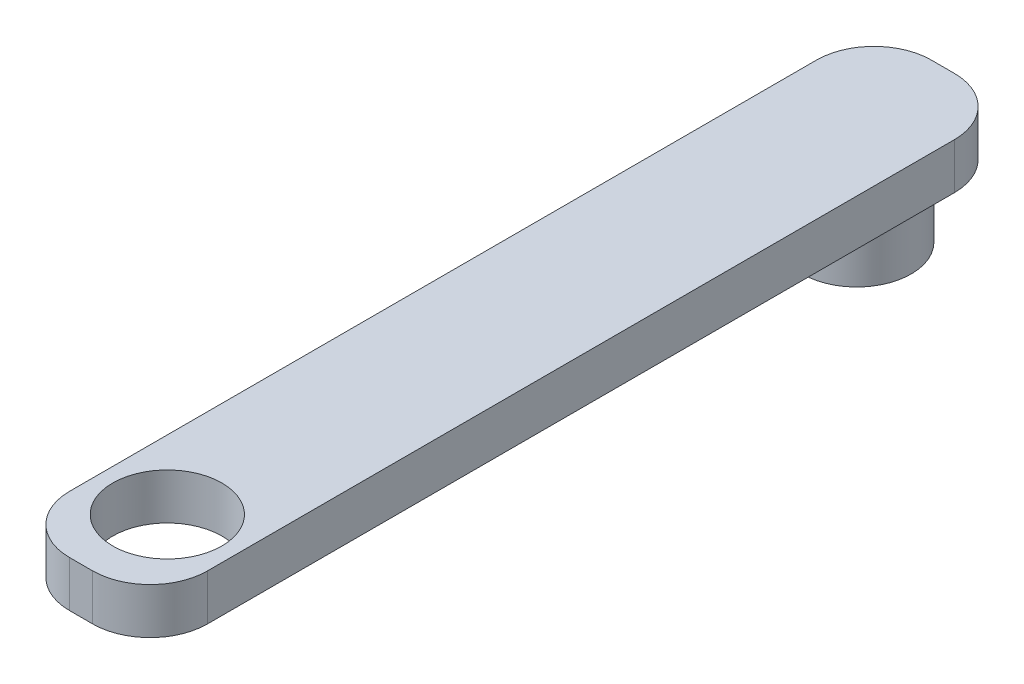
ISO-10303-21;
HEADER;
FILE_DESCRIPTION(('STEP AP214'),'2;1');
FILE_NAME('part.step','',(''),(''),'','','');
FILE_SCHEMA(('AUTOMOTIVE_DESIGN { 1 0 10303 214 1 1 1 1 }'));
ENDSEC;
DATA;
#1=APPLICATION_CONTEXT('core data for automotive mechanical design processes');
#2=APPLICATION_PROTOCOL_DEFINITION('international standard','automotive_design',2000,#1);
#3=PRODUCT_CONTEXT('',#1,'mechanical');
#4=PRODUCT('Part','Part','',(#3));
#5=PRODUCT_RELATED_PRODUCT_CATEGORY('part','',(#4));
#6=PRODUCT_DEFINITION_FORMATION('','',#4);
#7=PRODUCT_DEFINITION_CONTEXT('part definition',#1,'design');
#8=PRODUCT_DEFINITION('design','',#6,#7);
#9=PRODUCT_DEFINITION_SHAPE('','',#8);
#10=(LENGTH_UNIT() NAMED_UNIT(*) SI_UNIT(.MILLI.,.METRE.));
#11=(NAMED_UNIT(*) PLANE_ANGLE_UNIT() SI_UNIT($,.RADIAN.));
#12=(NAMED_UNIT(*) SI_UNIT($,.STERADIAN.) SOLID_ANGLE_UNIT());
#13=UNCERTAINTY_MEASURE_WITH_UNIT(LENGTH_MEASURE(1.E-05),#10,'distance_accuracy_value','');
#14=(GEOMETRIC_REPRESENTATION_CONTEXT(3) GLOBAL_UNCERTAINTY_ASSIGNED_CONTEXT((#13)) GLOBAL_UNIT_ASSIGNED_CONTEXT((#10,
#11,#12)) REPRESENTATION_CONTEXT('',''));
#15=CARTESIAN_POINT('',(0.,0.,0.));
#16=DIRECTION('',(0.,0.,1.));
#17=DIRECTION('',(1.,0.,0.));
#18=AXIS2_PLACEMENT_3D('',#15,#16,#17);
#19=CARTESIAN_POINT('',(0.999999999999998,4.,32.5));
#20=DIRECTION('',(0.,-1.,0.));
#21=DIRECTION('',(0.,0.,-1.));
#22=AXIS2_PLACEMENT_3D('',#19,#20,#21);
#23=CYLINDRICAL_SURFACE('',#22,5.);
#24=CARTESIAN_POINT('',(0.999999999999998,0.,32.5));
#25=DIRECTION('',(0.,1.,0.));
#26=DIRECTION('',(0.,0.,1.));
#27=AXIS2_PLACEMENT_3D('',#24,#25,#26);
#28=CIRCLE('',#27,5.);
#29=CARTESIAN_POINT('',(0.999999999999998,0.,37.5));
#30=VERTEX_POINT('',#29);
#31=CARTESIAN_POINT('',(6.,0.,32.5));
#32=VERTEX_POINT('',#31);
#33=EDGE_CURVE('E135',#30,#32,#28,.T.);
#34=ORIENTED_EDGE('',*,*,#33,.T.);
#35=DIRECTION('',(0.,-1.,0.));
#36=VECTOR('',#35,1.);
#37=CARTESIAN_POINT('',(6.,4.,32.5));
#38=LINE('',#37,#36);
#39=CARTESIAN_POINT('',(6.,4.,32.5));
#40=VERTEX_POINT('',#39);
#41=EDGE_CURVE('E11',#40,#32,#38,.T.);
#42=ORIENTED_EDGE('',*,*,#41,.F.);
#43=CARTESIAN_POINT('',(0.999999999999998,4.,32.5));
#44=DIRECTION('',(0.,1.,0.));
#45=DIRECTION('',(0.,0.,1.));
#46=AXIS2_PLACEMENT_3D('',#43,#44,#45);
#47=CIRCLE('',#46,5.);
#48=CARTESIAN_POINT('',(0.999999999999998,4.,37.5));
#49=VERTEX_POINT('',#48);
#50=EDGE_CURVE('E154',#49,#40,#47,.T.);
#51=ORIENTED_EDGE('',*,*,#50,.F.);
#52=DIRECTION('',(0.,-1.,0.));
#53=VECTOR('',#52,1.);
#54=CARTESIAN_POINT('',(0.999999999999998,4.,37.5));
#55=LINE('',#54,#53);
#56=EDGE_CURVE('E131',#49,#30,#55,.T.);
#57=ORIENTED_EDGE('',*,*,#56,.T.);
#58=EDGE_LOOP('',(#34,#42,#51,#57));
#59=FACE_BOUND('',#58,.T.);
#60=ADVANCED_FACE('F40',(#59),#23,.T.);
#61=CARTESIAN_POINT('',(6.,4.,32.5));
#62=DIRECTION('',(-1.,0.,0.));
#63=DIRECTION('',(0.,0.,1.));
#64=AXIS2_PLACEMENT_3D('',#61,#62,#63);
#65=PLANE('',#64);
#66=DIRECTION('',(0.,0.,-1.));
#67=VECTOR('',#66,1.);
#68=CARTESIAN_POINT('',(6.,0.,32.5));
#69=LINE('',#68,#67);
#70=CARTESIAN_POINT('',(6.,0.,-32.5));
#71=VERTEX_POINT('',#70);
#72=EDGE_CURVE('E138',#32,#71,#69,.T.);
#73=ORIENTED_EDGE('',*,*,#72,.T.);
#74=DIRECTION('',(0.,-1.,0.));
#75=VECTOR('',#74,1.);
#76=CARTESIAN_POINT('',(6.,4.,-32.5));
#77=LINE('',#76,#75);
#78=CARTESIAN_POINT('',(6.,4.,-32.5));
#79=VERTEX_POINT('',#78);
#80=EDGE_CURVE('E48',#79,#71,#77,.T.);
#81=ORIENTED_EDGE('',*,*,#80,.F.);
#82=DIRECTION('',(0.,0.,-1.));
#83=VECTOR('',#82,1.);
#84=CARTESIAN_POINT('',(6.,4.,32.5));
#85=LINE('',#84,#83);
#86=EDGE_CURVE('E95',#40,#79,#85,.T.);
#87=ORIENTED_EDGE('',*,*,#86,.F.);
#88=ORIENTED_EDGE('',*,*,#41,.T.);
#89=EDGE_LOOP('',(#73,#81,#87,#88));
#90=FACE_BOUND('',#89,.T.);
#91=ADVANCED_FACE('F214',(#90),#65,.F.);
#92=CARTESIAN_POINT('',(0.999999999999998,4.,-32.5));
#93=DIRECTION('',(0.,-1.,0.));
#94=DIRECTION('',(0.,0.,-1.));
#95=AXIS2_PLACEMENT_3D('',#92,#93,#94);
#96=CYLINDRICAL_SURFACE('',#95,5.);
#97=CARTESIAN_POINT('',(0.999999999999998,0.,-32.5));
#98=DIRECTION('',(0.,1.,0.));
#99=DIRECTION('',(0.,0.,1.));
#100=AXIS2_PLACEMENT_3D('',#97,#98,#99);
#101=CIRCLE('',#100,5.);
#102=CARTESIAN_POINT('',(0.999999999999999,0.,-37.5));
#103=VERTEX_POINT('',#102);
#104=EDGE_CURVE('E141',#71,#103,#101,.T.);
#105=ORIENTED_EDGE('',*,*,#104,.T.);
#106=DIRECTION('',(0.,-1.,0.));
#107=VECTOR('',#106,1.);
#108=CARTESIAN_POINT('',(0.999999999999999,4.,-37.5));
#109=LINE('',#108,#107);
#110=CARTESIAN_POINT('',(0.999999999999999,4.,-37.5));
#111=VERTEX_POINT('',#110);
#112=EDGE_CURVE('E160',#111,#103,#109,.T.);
#113=ORIENTED_EDGE('',*,*,#112,.F.);
#114=CARTESIAN_POINT('',(0.999999999999998,4.,-32.5));
#115=DIRECTION('',(0.,1.,0.));
#116=DIRECTION('',(0.,0.,1.));
#117=AXIS2_PLACEMENT_3D('',#114,#115,#116);
#118=CIRCLE('',#117,5.);
#119=EDGE_CURVE('E167',#79,#111,#118,.T.);
#120=ORIENTED_EDGE('',*,*,#119,.F.);
#121=ORIENTED_EDGE('',*,*,#80,.T.);
#122=EDGE_LOOP('',(#105,#113,#120,#121));
#123=FACE_BOUND('',#122,.T.);
#124=ADVANCED_FACE('F165',(#123),#96,.T.);
#125=CARTESIAN_POINT('',(-1.,4.,-37.5));
#126=DIRECTION('',(0.,0.,-1.));
#127=DIRECTION('',(-1.,0.,0.));
#128=AXIS2_PLACEMENT_3D('',#125,#126,#127);
#129=PLANE('',#128);
#130=DIRECTION('',(1.,0.,0.));
#131=VECTOR('',#130,1.);
#132=CARTESIAN_POINT('',(-1.,0.,-37.5));
#133=LINE('',#132,#131);
#134=CARTESIAN_POINT('',(-1.,0.,-37.5));
#135=VERTEX_POINT('',#134);
#136=EDGE_CURVE('E144',#135,#103,#133,.T.);
#137=ORIENTED_EDGE('',*,*,#136,.F.);
#138=DIRECTION('',(0.,-1.,0.));
#139=VECTOR('',#138,1.);
#140=CARTESIAN_POINT('',(-1.,4.,-37.5));
#141=LINE('',#140,#139);
#142=CARTESIAN_POINT('',(-1.,4.,-37.5));
#143=VERTEX_POINT('',#142);
#144=EDGE_CURVE('E158',#143,#135,#141,.T.);
#145=ORIENTED_EDGE('',*,*,#144,.F.);
#146=DIRECTION('',(1.,0.,0.));
#147=VECTOR('',#146,1.);
#148=CARTESIAN_POINT('',(-1.,4.,-37.5));
#149=LINE('',#148,#147);
#150=EDGE_CURVE('E176',#143,#111,#149,.T.);
#151=ORIENTED_EDGE('',*,*,#150,.T.);
#152=ORIENTED_EDGE('',*,*,#112,.T.);
#153=EDGE_LOOP('',(#137,#145,#151,#152));
#154=FACE_BOUND('',#153,.T.);
#155=ADVANCED_FACE('F174',(#154),#129,.T.);
#156=CARTESIAN_POINT('',(-1.,4.,-32.5));
#157=DIRECTION('',(0.,-1.,0.));
#158=DIRECTION('',(0.,0.,-1.));
#159=AXIS2_PLACEMENT_3D('',#156,#157,#158);
#160=CYLINDRICAL_SURFACE('',#159,5.);
#161=CARTESIAN_POINT('',(-1.,0.,-32.5));
#162=DIRECTION('',(0.,1.,0.));
#163=DIRECTION('',(0.,0.,1.));
#164=AXIS2_PLACEMENT_3D('',#161,#162,#163);
#165=CIRCLE('',#164,5.);
#166=CARTESIAN_POINT('',(-6.,0.,-32.5));
#167=VERTEX_POINT('',#166);
#168=EDGE_CURVE('E147',#135,#167,#165,.T.);
#169=ORIENTED_EDGE('',*,*,#168,.T.);
#170=DIRECTION('',(0.,-1.,0.));
#171=VECTOR('',#170,1.);
#172=CARTESIAN_POINT('',(-6.,4.,-32.5));
#173=LINE('',#172,#171);
#174=CARTESIAN_POINT('',(-6.,4.,-32.5));
#175=VERTEX_POINT('',#174);
#176=EDGE_CURVE('E120',#175,#167,#173,.T.);
#177=ORIENTED_EDGE('',*,*,#176,.F.);
#178=CARTESIAN_POINT('',(-1.,4.,-32.5));
#179=DIRECTION('',(0.,1.,0.));
#180=DIRECTION('',(0.,0.,1.));
#181=AXIS2_PLACEMENT_3D('',#178,#179,#180);
#182=CIRCLE('',#181,5.);
#183=EDGE_CURVE('E126',#143,#175,#182,.T.);
#184=ORIENTED_EDGE('',*,*,#183,.F.);
#185=ORIENTED_EDGE('',*,*,#144,.T.);
#186=EDGE_LOOP('',(#169,#177,#184,#185));
#187=FACE_BOUND('',#186,.T.);
#188=ADVANCED_FACE('F233',(#187),#160,.T.);
#189=CARTESIAN_POINT('',(-6.,4.,32.5));
#190=DIRECTION('',(-1.,0.,0.));
#191=DIRECTION('',(0.,0.,1.));
#192=AXIS2_PLACEMENT_3D('',#189,#190,#191);
#193=PLANE('',#192);
#194=DIRECTION('',(0.,0.,-1.));
#195=VECTOR('',#194,1.);
#196=CARTESIAN_POINT('',(-6.,0.,32.5));
#197=LINE('',#196,#195);
#198=CARTESIAN_POINT('',(-6.,0.,32.5));
#199=VERTEX_POINT('',#198);
#200=EDGE_CURVE('E115',#199,#167,#197,.T.);
#201=ORIENTED_EDGE('',*,*,#200,.F.);
#202=DIRECTION('',(0.,-1.,0.));
#203=VECTOR('',#202,1.);
#204=CARTESIAN_POINT('',(-6.,4.,32.5));
#205=LINE('',#204,#203);
#206=CARTESIAN_POINT('',(-6.,4.,32.5));
#207=VERTEX_POINT('',#206);
#208=EDGE_CURVE('E110',#207,#199,#205,.T.);
#209=ORIENTED_EDGE('',*,*,#208,.F.);
#210=DIRECTION('',(0.,0.,-1.));
#211=VECTOR('',#210,1.);
#212=CARTESIAN_POINT('',(-6.,4.,32.5));
#213=LINE('',#212,#211);
#214=EDGE_CURVE('E113',#207,#175,#213,.T.);
#215=ORIENTED_EDGE('',*,*,#214,.T.);
#216=ORIENTED_EDGE('',*,*,#176,.T.);
#217=EDGE_LOOP('',(#201,#209,#215,#216));
#218=FACE_BOUND('',#217,.T.);
#219=ADVANCED_FACE('F112',(#218),#193,.T.);
#220=CARTESIAN_POINT('',(-1.,4.,32.5));
#221=DIRECTION('',(0.,-1.,0.));
#222=DIRECTION('',(0.,0.,-1.));
#223=AXIS2_PLACEMENT_3D('',#220,#221,#222);
#224=CYLINDRICAL_SURFACE('',#223,5.);
#225=CARTESIAN_POINT('',(-1.,0.,32.5));
#226=DIRECTION('',(0.,-1.,0.));
#227=DIRECTION('',(0.,0.,-1.));
#228=AXIS2_PLACEMENT_3D('',#225,#226,#227);
#229=CIRCLE('',#228,5.);
#230=CARTESIAN_POINT('',(-1.,0.,37.5));
#231=VERTEX_POINT('',#230);
#232=EDGE_CURVE('E151',#231,#199,#229,.T.);
#233=ORIENTED_EDGE('',*,*,#232,.F.);
#234=DIRECTION('',(0.,-1.,0.));
#235=VECTOR('',#234,1.);
#236=CARTESIAN_POINT('',(-1.,4.,37.5));
#237=LINE('',#236,#235);
#238=CARTESIAN_POINT('',(-1.,4.,37.5));
#239=VERTEX_POINT('',#238);
#240=EDGE_CURVE('E84',#239,#231,#237,.T.);
#241=ORIENTED_EDGE('',*,*,#240,.F.);
#242=CARTESIAN_POINT('',(-1.,4.,32.5));
#243=DIRECTION('',(0.,-1.,0.));
#244=DIRECTION('',(0.,0.,-1.));
#245=AXIS2_PLACEMENT_3D('',#242,#243,#244);
#246=CIRCLE('',#245,5.);
#247=EDGE_CURVE('E123',#239,#207,#246,.T.);
#248=ORIENTED_EDGE('',*,*,#247,.T.);
#249=ORIENTED_EDGE('',*,*,#208,.T.);
#250=EDGE_LOOP('',(#233,#241,#248,#249));
#251=FACE_BOUND('',#250,.T.);
#252=ADVANCED_FACE('F129',(#251),#224,.T.);
#253=CARTESIAN_POINT('',(-1.,4.,37.5));
#254=DIRECTION('',(0.,0.,-1.));
#255=DIRECTION('',(-1.,0.,0.));
#256=AXIS2_PLACEMENT_3D('',#253,#254,#255);
#257=PLANE('',#256);
#258=DIRECTION('',(1.,0.,0.));
#259=VECTOR('',#258,1.);
#260=CARTESIAN_POINT('',(-1.,0.,37.5));
#261=LINE('',#260,#259);
#262=EDGE_CURVE('E87',#231,#30,#261,.T.);
#263=ORIENTED_EDGE('',*,*,#262,.T.);
#264=ORIENTED_EDGE('',*,*,#56,.F.);
#265=DIRECTION('',(1.,0.,0.));
#266=VECTOR('',#265,1.);
#267=CARTESIAN_POINT('',(-1.,4.,37.5));
#268=LINE('',#267,#266);
#269=EDGE_CURVE('E56',#239,#49,#268,.T.);
#270=ORIENTED_EDGE('',*,*,#269,.F.);
#271=ORIENTED_EDGE('',*,*,#240,.T.);
#272=EDGE_LOOP('',(#263,#264,#270,#271));
#273=FACE_BOUND('',#272,.T.);
#274=ADVANCED_FACE('F221',(#273),#257,.F.);
#275=CARTESIAN_POINT('',(0.999999999999998,4.,32.5));
#276=DIRECTION('',(0.,1.,0.));
#277=DIRECTION('',(0.,0.,1.));
#278=AXIS2_PLACEMENT_3D('',#275,#276,#277);
#279=PLANE('',#278);
#280=CARTESIAN_POINT('',(0.,4.,30.));
#281=DIRECTION('',(0.,1.,0.));
#282=DIRECTION('',(0.,0.,1.));
#283=AXIS2_PLACEMENT_3D('',#280,#281,#282);
#284=CIRCLE('',#283,4.75);
#285=CARTESIAN_POINT('',(0.,4.,34.75));
#286=VERTEX_POINT('',#285);
#287=EDGE_CURVE('E185',#286,#286,#284,.F.);
#288=ORIENTED_EDGE('',*,*,#287,.T.);
#289=EDGE_LOOP('',(#288));
#290=FACE_BOUND('',#289,.T.);
#291=ORIENTED_EDGE('',*,*,#50,.T.);
#292=ORIENTED_EDGE('',*,*,#86,.T.);
#293=ORIENTED_EDGE('',*,*,#119,.T.);
#294=ORIENTED_EDGE('',*,*,#150,.F.);
#295=ORIENTED_EDGE('',*,*,#183,.T.);
#296=ORIENTED_EDGE('',*,*,#214,.F.);
#297=ORIENTED_EDGE('',*,*,#247,.F.);
#298=ORIENTED_EDGE('',*,*,#269,.T.);
#299=EDGE_LOOP('',(#291,#292,#293,#294,#295,#296,#297,#298));
#300=FACE_BOUND('',#299,.T.);
#301=ADVANCED_FACE('F122',(#290,#300),#279,.T.);
#302=CARTESIAN_POINT('',(0.999999999999998,0.,32.5));
#303=DIRECTION('',(0.,1.,0.));
#304=DIRECTION('',(0.,0.,1.));
#305=AXIS2_PLACEMENT_3D('',#302,#303,#304);
#306=PLANE('',#305);
#307=CARTESIAN_POINT('',(0.,0.,30.));
#308=DIRECTION('',(0.,-1.,0.));
#309=DIRECTION('',(0.,0.,-1.));
#310=AXIS2_PLACEMENT_3D('',#307,#308,#309);
#311=CIRCLE('',#310,4.75);
#312=CARTESIAN_POINT('',(0.,0.,25.25));
#313=VERTEX_POINT('',#312);
#314=EDGE_CURVE('E190',#313,#313,#311,.T.);
#315=ORIENTED_EDGE('',*,*,#314,.F.);
#316=EDGE_LOOP('',(#315));
#317=FACE_BOUND('',#316,.T.);
#318=CARTESIAN_POINT('',(0.,0.,-30.));
#319=DIRECTION('',(0.,1.,0.));
#320=DIRECTION('',(0.,0.,1.));
#321=AXIS2_PLACEMENT_3D('',#318,#319,#320);
#322=CIRCLE('',#321,4.75);
#323=CARTESIAN_POINT('',(0.,0.,-25.25));
#324=VERTEX_POINT('',#323);
#325=EDGE_CURVE('E182',#324,#324,#322,.T.);
#326=ORIENTED_EDGE('',*,*,#325,.T.);
#327=EDGE_LOOP('',(#326));
#328=FACE_BOUND('',#327,.T.);
#329=ORIENTED_EDGE('',*,*,#33,.F.);
#330=ORIENTED_EDGE('',*,*,#262,.F.);
#331=ORIENTED_EDGE('',*,*,#232,.T.);
#332=ORIENTED_EDGE('',*,*,#200,.T.);
#333=ORIENTED_EDGE('',*,*,#168,.F.);
#334=ORIENTED_EDGE('',*,*,#136,.T.);
#335=ORIENTED_EDGE('',*,*,#104,.F.);
#336=ORIENTED_EDGE('',*,*,#72,.F.);
#337=EDGE_LOOP('',(#329,#330,#331,#332,#333,#334,#335,#336));
#338=FACE_BOUND('',#337,.T.);
#339=ADVANCED_FACE('F170',(#317,#328,#338),#306,.F.);
#340=CARTESIAN_POINT('',(0.,-5.5,-30.));
#341=DIRECTION('',(0.,1.,0.));
#342=DIRECTION('',(0.,0.,1.));
#343=AXIS2_PLACEMENT_3D('',#340,#341,#342);
#344=CYLINDRICAL_SURFACE('',#343,4.75);
#345=CARTESIAN_POINT('',(0.,-5.5,-30.));
#346=DIRECTION('',(0.,1.,0.));
#347=DIRECTION('',(0.,0.,1.));
#348=AXIS2_PLACEMENT_3D('',#345,#346,#347);
#349=CIRCLE('',#348,4.75);
#350=CARTESIAN_POINT('',(0.,-5.5,-25.25));
#351=VERTEX_POINT('',#350);
#352=EDGE_CURVE('E139',#351,#351,#349,.T.);
#353=ORIENTED_EDGE('',*,*,#352,.T.);
#354=EDGE_LOOP('',(#353));
#355=FACE_BOUND('',#354,.T.);
#356=ORIENTED_EDGE('',*,*,#325,.F.);
#357=EDGE_LOOP('',(#356));
#358=FACE_BOUND('',#357,.T.);
#359=ADVANCED_FACE('F199',(#355,#358),#344,.T.);
#360=CARTESIAN_POINT('',(0.,-5.5,0.));
#361=DIRECTION('',(0.,1.,0.));
#362=DIRECTION('',(0.,0.,1.));
#363=AXIS2_PLACEMENT_3D('',#360,#361,#362);
#364=PLANE('',#363);
#365=ORIENTED_EDGE('',*,*,#352,.F.);
#366=EDGE_LOOP('',(#365));
#367=FACE_BOUND('',#366,.T.);
#368=ADVANCED_FACE('F204',(#367),#364,.F.);
#369=CARTESIAN_POINT('',(0.,17.4350288425444,30.));
#370=DIRECTION('',(0.,-1.,0.));
#371=DIRECTION('',(0.,0.,-1.));
#372=AXIS2_PLACEMENT_3D('',#369,#370,#371);
#373=CYLINDRICAL_SURFACE('',#372,4.75);
#374=ORIENTED_EDGE('',*,*,#314,.T.);
#375=EDGE_LOOP('',(#374));
#376=FACE_BOUND('',#375,.T.);
#377=ORIENTED_EDGE('',*,*,#287,.F.);
#378=EDGE_LOOP('',(#377));
#379=FACE_BOUND('',#378,.T.);
#380=ADVANCED_FACE('F194',(#376,#379),#373,.F.);
#381=CLOSED_SHELL('',(#60,#91,#124,#155,#188,#219,#252,#274,#301,#339,#359,#368,#380));
#382=MANIFOLD_SOLID_BREP('B2',#381);
#383=ADVANCED_BREP_SHAPE_REPRESENTATION('',(#18,#382),#14);
#384=SHAPE_DEFINITION_REPRESENTATION(#9,#383);
ENDSEC;
END-ISO-10303-21;
